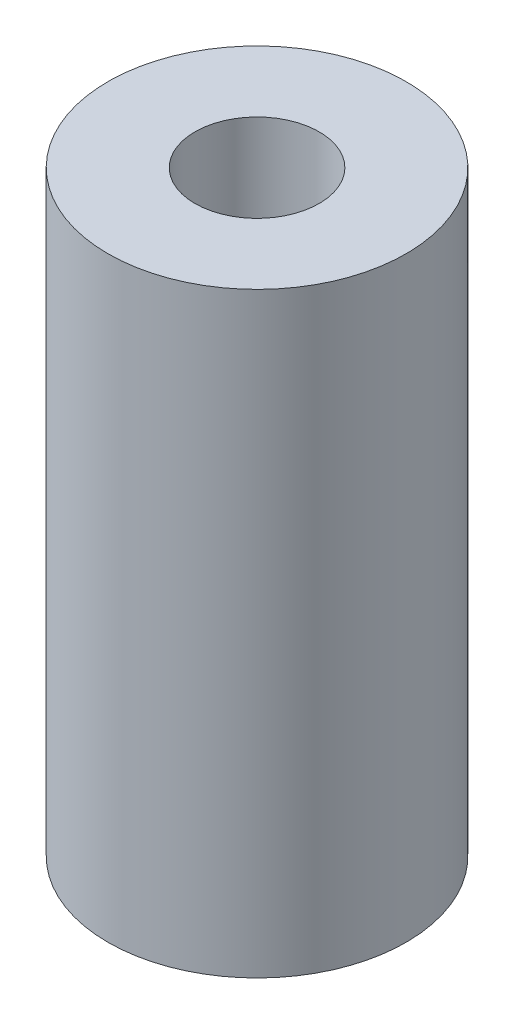
ISO-10303-21;
HEADER;
FILE_DESCRIPTION(('STEP AP214'),'2;1');
FILE_NAME('part.step','',(''),(''),'','','');
FILE_SCHEMA(('AUTOMOTIVE_DESIGN { 1 0 10303 214 1 1 1 1 }'));
ENDSEC;
DATA;
#1=APPLICATION_CONTEXT('core data for automotive mechanical design processes');
#2=APPLICATION_PROTOCOL_DEFINITION('international standard','automotive_design',2000,#1);
#3=PRODUCT_CONTEXT('',#1,'mechanical');
#4=PRODUCT('Part','Part','',(#3));
#5=PRODUCT_RELATED_PRODUCT_CATEGORY('part','',(#4));
#6=PRODUCT_DEFINITION_FORMATION('','',#4);
#7=PRODUCT_DEFINITION_CONTEXT('part definition',#1,'design');
#8=PRODUCT_DEFINITION('design','',#6,#7);
#9=PRODUCT_DEFINITION_SHAPE('','',#8);
#10=(LENGTH_UNIT() NAMED_UNIT(*) SI_UNIT(.MILLI.,.METRE.));
#11=(NAMED_UNIT(*) PLANE_ANGLE_UNIT() SI_UNIT($,.RADIAN.));
#12=(NAMED_UNIT(*) SI_UNIT($,.STERADIAN.) SOLID_ANGLE_UNIT());
#13=UNCERTAINTY_MEASURE_WITH_UNIT(LENGTH_MEASURE(1.E-05),#10,'distance_accuracy_value','');
#14=(GEOMETRIC_REPRESENTATION_CONTEXT(3) GLOBAL_UNCERTAINTY_ASSIGNED_CONTEXT((#13)) GLOBAL_UNIT_ASSIGNED_CONTEXT((#10,
#11,#12)) REPRESENTATION_CONTEXT('',''));
#15=CARTESIAN_POINT('',(0.,0.,0.));
#16=DIRECTION('',(0.,0.,1.));
#17=DIRECTION('',(1.,0.,0.));
#18=AXIS2_PLACEMENT_3D('',#15,#16,#17);
#19=CARTESIAN_POINT('',(0.,24.,0.));
#20=DIRECTION('',(0.,-1.,0.));
#21=DIRECTION('',(0.,0.,-1.));
#22=AXIS2_PLACEMENT_3D('',#19,#20,#21);
#23=CYLINDRICAL_SURFACE('',#22,6.);
#24=CARTESIAN_POINT('',(0.,24.,0.));
#25=DIRECTION('',(0.,1.,0.));
#26=DIRECTION('',(0.,0.,1.));
#27=AXIS2_PLACEMENT_3D('',#24,#25,#26);
#28=CIRCLE('',#27,6.);
#29=CARTESIAN_POINT('',(0.,24.,6.));
#30=VERTEX_POINT('',#29);
#31=EDGE_CURVE('E10',#30,#30,#28,.T.);
#32=ORIENTED_EDGE('',*,*,#31,.F.);
#33=EDGE_LOOP('',(#32));
#34=FACE_BOUND('',#33,.T.);
#35=CARTESIAN_POINT('',(0.,0.,0.));
#36=DIRECTION('',(0.,1.,0.));
#37=DIRECTION('',(0.,0.,1.));
#38=AXIS2_PLACEMENT_3D('',#35,#36,#37);
#39=CIRCLE('',#38,6.);
#40=CARTESIAN_POINT('',(0.,0.,6.));
#41=VERTEX_POINT('',#40);
#42=EDGE_CURVE('E34',#41,#41,#39,.T.);
#43=ORIENTED_EDGE('',*,*,#42,.T.);
#44=EDGE_LOOP('',(#43));
#45=FACE_BOUND('',#44,.T.);
#46=ADVANCED_FACE('F31',(#34,#45),#23,.T.);
#47=CARTESIAN_POINT('',(0.,24.,0.));
#48=DIRECTION('',(0.,1.,0.));
#49=DIRECTION('',(0.,0.,1.));
#50=AXIS2_PLACEMENT_3D('',#47,#48,#49);
#51=PLANE('',#50);
#52=CARTESIAN_POINT('',(0.,24.,0.));
#53=DIRECTION('',(0.,1.,0.));
#54=DIRECTION('',(0.,0.,1.));
#55=AXIS2_PLACEMENT_3D('',#52,#53,#54);
#56=CIRCLE('',#55,2.5);
#57=CARTESIAN_POINT('',(0.,24.,2.5));
#58=VERTEX_POINT('',#57);
#59=EDGE_CURVE('E41',#58,#58,#56,.T.);
#60=ORIENTED_EDGE('',*,*,#59,.F.);
#61=EDGE_LOOP('',(#60));
#62=FACE_BOUND('',#61,.T.);
#63=ORIENTED_EDGE('',*,*,#31,.T.);
#64=EDGE_LOOP('',(#63));
#65=FACE_BOUND('',#64,.T.);
#66=ADVANCED_FACE('F55',(#62,#65),#51,.T.);
#67=CARTESIAN_POINT('',(0.,0.,0.));
#68=DIRECTION('',(0.,1.,0.));
#69=DIRECTION('',(0.,0.,1.));
#70=AXIS2_PLACEMENT_3D('',#67,#68,#69);
#71=PLANE('',#70);
#72=CARTESIAN_POINT('',(0.,0.,0.));
#73=DIRECTION('',(0.,-1.,0.));
#74=DIRECTION('',(0.,0.,-1.));
#75=AXIS2_PLACEMENT_3D('',#72,#73,#74);
#76=CIRCLE('',#75,2.5);
#77=CARTESIAN_POINT('',(0.,0.,-2.5));
#78=VERTEX_POINT('',#77);
#79=EDGE_CURVE('E45',#78,#78,#76,.T.);
#80=ORIENTED_EDGE('',*,*,#79,.F.);
#81=EDGE_LOOP('',(#80));
#82=FACE_BOUND('',#81,.T.);
#83=ORIENTED_EDGE('',*,*,#42,.F.);
#84=EDGE_LOOP('',(#83));
#85=FACE_BOUND('',#84,.T.);
#86=ADVANCED_FACE('F52',(#82,#85),#71,.F.);
#87=CARTESIAN_POINT('',(0.,6.,0.));
#88=DIRECTION('',(0.,1.,0.));
#89=DIRECTION('',(0.,0.,1.));
#90=AXIS2_PLACEMENT_3D('',#87,#88,#89);
#91=CYLINDRICAL_SURFACE('',#90,2.5);
#92=ORIENTED_EDGE('',*,*,#79,.T.);
#93=EDGE_LOOP('',(#92));
#94=FACE_BOUND('',#93,.T.);
#95=ORIENTED_EDGE('',*,*,#59,.T.);
#96=EDGE_LOOP('',(#95));
#97=FACE_BOUND('',#96,.T.);
#98=ADVANCED_FACE('F49',(#94,#97),#91,.F.);
#99=CLOSED_SHELL('',(#46,#66,#86,#98));
#100=MANIFOLD_SOLID_BREP('B2',#99);
#101=ADVANCED_BREP_SHAPE_REPRESENTATION('',(#18,#100),#14);
#102=SHAPE_DEFINITION_REPRESENTATION(#9,#101);
ENDSEC;
END-ISO-10303-21;
